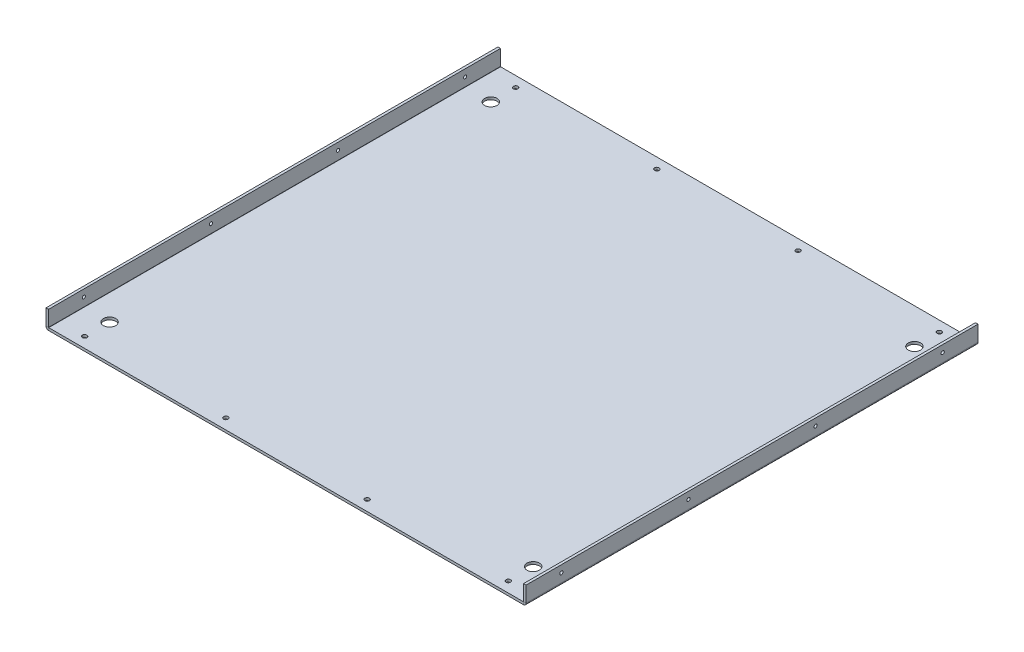
ISO-10303-21;
HEADER;
FILE_DESCRIPTION(('STEP AP214'),'2;1');
FILE_NAME('part.step','',(''),(''),'','','');
FILE_SCHEMA(('AUTOMOTIVE_DESIGN { 1 0 10303 214 1 1 1 1 }'));
ENDSEC;
DATA;
#1=APPLICATION_CONTEXT('core data for automotive mechanical design processes');
#2=APPLICATION_PROTOCOL_DEFINITION('international standard','automotive_design',2000,#1);
#3=PRODUCT_CONTEXT('',#1,'mechanical');
#4=PRODUCT('Part','Part','',(#3));
#5=PRODUCT_RELATED_PRODUCT_CATEGORY('part','',(#4));
#6=PRODUCT_DEFINITION_FORMATION('','',#4);
#7=PRODUCT_DEFINITION_CONTEXT('part definition',#1,'design');
#8=PRODUCT_DEFINITION('design','',#6,#7);
#9=PRODUCT_DEFINITION_SHAPE('','',#8);
#10=(LENGTH_UNIT() NAMED_UNIT(*) SI_UNIT(.MILLI.,.METRE.));
#11=(NAMED_UNIT(*) PLANE_ANGLE_UNIT() SI_UNIT($,.RADIAN.));
#12=(NAMED_UNIT(*) SI_UNIT($,.STERADIAN.) SOLID_ANGLE_UNIT());
#13=UNCERTAINTY_MEASURE_WITH_UNIT(LENGTH_MEASURE(1.E-05),#10,'distance_accuracy_value','');
#14=(GEOMETRIC_REPRESENTATION_CONTEXT(3) GLOBAL_UNCERTAINTY_ASSIGNED_CONTEXT((#13)) GLOBAL_UNIT_ASSIGNED_CONTEXT((#10,
#11,#12)) REPRESENTATION_CONTEXT('',''));
#15=CARTESIAN_POINT('',(0.,0.,0.));
#16=DIRECTION('',(0.,0.,1.));
#17=DIRECTION('',(1.,0.,0.));
#18=AXIS2_PLACEMENT_3D('',#15,#16,#17);
#19=CARTESIAN_POINT('',(0.,2.4384,406.4));
#20=DIRECTION('',(0.,0.,1.));
#21=DIRECTION('',(1.,0.,0.));
#22=AXIS2_PLACEMENT_3D('',#19,#20,#21);
#23=PLANE('',#22);
#24=DIRECTION('',(1.,0.,0.));
#25=VECTOR('',#24,1.);
#26=CARTESIAN_POINT('',(0.,2.4384,406.4));
#27=LINE('',#26,#25);
#28=CARTESIAN_POINT('',(0.,2.4384,406.4));
#29=VERTEX_POINT('',#28);
#30=CARTESIAN_POINT('',(2.286,2.4384,406.4));
#31=VERTEX_POINT('',#30);
#32=EDGE_CURVE('E11',#29,#31,#27,.T.);
#33=ORIENTED_EDGE('',*,*,#32,.F.);
#34=CARTESIAN_POINT('',(2.4384,2.4384,406.4));
#35=DIRECTION('',(0.,0.,-1.));
#36=DIRECTION('',(-1.,0.,0.));
#37=AXIS2_PLACEMENT_3D('',#34,#35,#36);
#38=CIRCLE('',#37,2.4384);
#39=CARTESIAN_POINT('',(2.4384,0.,406.4));
#40=VERTEX_POINT('',#39);
#41=EDGE_CURVE('E149',#29,#40,#38,.F.);
#42=ORIENTED_EDGE('',*,*,#41,.T.);
#43=DIRECTION('',(0.,-1.,0.));
#44=VECTOR('',#43,1.);
#45=CARTESIAN_POINT('',(2.4384,2.286,406.4));
#46=LINE('',#45,#44);
#47=CARTESIAN_POINT('',(2.4384,2.286,406.4));
#48=VERTEX_POINT('',#47);
#49=EDGE_CURVE('E47',#48,#40,#46,.T.);
#50=ORIENTED_EDGE('',*,*,#49,.F.);
#51=CARTESIAN_POINT('',(2.4384,2.4384,406.4));
#52=DIRECTION('',(0.,0.,1.));
#53=DIRECTION('',(1.,0.,0.));
#54=AXIS2_PLACEMENT_3D('',#51,#52,#53);
#55=CIRCLE('',#54,0.1524);
#56=EDGE_CURVE('E244',#31,#48,#55,.T.);
#57=ORIENTED_EDGE('',*,*,#56,.F.);
#58=EDGE_LOOP('',(#33,#42,#50,#57));
#59=FACE_BOUND('',#58,.T.);
#60=ADVANCED_FACE('F39',(#59),#23,.T.);
#61=CARTESIAN_POINT('',(2.4384,2.286,406.4));
#62=DIRECTION('',(0.,0.,1.));
#63=DIRECTION('',(1.,0.,0.));
#64=AXIS2_PLACEMENT_3D('',#61,#62,#63);
#65=PLANE('',#64);
#66=DIRECTION('',(0.,-1.,0.));
#67=VECTOR('',#66,1.);
#68=CARTESIAN_POINT('',(0.,0.,406.4));
#69=LINE('',#68,#67);
#70=CARTESIAN_POINT('',(0.,16.51,406.4));
#71=VERTEX_POINT('',#70);
#72=EDGE_CURVE('E154',#71,#29,#69,.T.);
#73=ORIENTED_EDGE('',*,*,#72,.T.);
#74=ORIENTED_EDGE('',*,*,#32,.T.);
#75=DIRECTION('',(0.,1.,0.));
#76=VECTOR('',#75,1.);
#77=CARTESIAN_POINT('',(2.286,0.,406.4));
#78=LINE('',#77,#76);
#79=CARTESIAN_POINT('',(2.286,16.51,406.4));
#80=VERTEX_POINT('',#79);
#81=EDGE_CURVE('E257',#80,#31,#78,.F.);
#82=ORIENTED_EDGE('',*,*,#81,.F.);
#83=DIRECTION('',(1.,0.,0.));
#84=VECTOR('',#83,1.);
#85=CARTESIAN_POINT('',(0.,16.51,406.4));
#86=LINE('',#85,#84);
#87=EDGE_CURVE('E259',#71,#80,#86,.T.);
#88=ORIENTED_EDGE('',*,*,#87,.F.);
#89=EDGE_LOOP('',(#73,#74,#82,#88));
#90=FACE_BOUND('',#89,.T.);
#91=ADVANCED_FACE('F270',(#90),#65,.T.);
#92=CARTESIAN_POINT('',(2.4384,0.,0.));
#93=DIRECTION('',(0.,0.,-1.));
#94=DIRECTION('',(-1.,0.,0.));
#95=AXIS2_PLACEMENT_3D('',#92,#93,#94);
#96=PLANE('',#95);
#97=DIRECTION('',(0.,1.,0.));
#98=VECTOR('',#97,1.);
#99=CARTESIAN_POINT('',(2.4384,0.,0.));
#100=LINE('',#99,#98);
#101=CARTESIAN_POINT('',(2.4384,0.,0.));
#102=VERTEX_POINT('',#101);
#103=CARTESIAN_POINT('',(2.4384,2.286,0.));
#104=VERTEX_POINT('',#103);
#105=EDGE_CURVE('E147',#102,#104,#100,.T.);
#106=ORIENTED_EDGE('',*,*,#105,.F.);
#107=CARTESIAN_POINT('',(2.4384,2.4384,0.));
#108=DIRECTION('',(0.,0.,-1.));
#109=DIRECTION('',(-1.,0.,0.));
#110=AXIS2_PLACEMENT_3D('',#107,#108,#109);
#111=CIRCLE('',#110,2.4384);
#112=CARTESIAN_POINT('',(0.,2.4384,0.));
#113=VERTEX_POINT('',#112);
#114=EDGE_CURVE('E161',#113,#102,#111,.F.);
#115=ORIENTED_EDGE('',*,*,#114,.F.);
#116=DIRECTION('',(-1.,0.,0.));
#117=VECTOR('',#116,1.);
#118=CARTESIAN_POINT('',(2.286,2.4384,0.));
#119=LINE('',#118,#117);
#120=CARTESIAN_POINT('',(2.286,2.4384,0.));
#121=VERTEX_POINT('',#120);
#122=EDGE_CURVE('E235',#121,#113,#119,.T.);
#123=ORIENTED_EDGE('',*,*,#122,.F.);
#124=CARTESIAN_POINT('',(2.4384,2.4384,0.));
#125=DIRECTION('',(0.,0.,1.));
#126=DIRECTION('',(1.,0.,0.));
#127=AXIS2_PLACEMENT_3D('',#124,#125,#126);
#128=CIRCLE('',#127,0.1524);
#129=EDGE_CURVE('E189',#121,#104,#128,.T.);
#130=ORIENTED_EDGE('',*,*,#129,.T.);
#131=EDGE_LOOP('',(#106,#115,#123,#130));
#132=FACE_BOUND('',#131,.T.);
#133=ADVANCED_FACE('F249',(#132),#96,.T.);
#134=CARTESIAN_POINT('',(2.286,2.4384,0.));
#135=DIRECTION('',(0.,0.,-1.));
#136=DIRECTION('',(-1.,0.,0.));
#137=AXIS2_PLACEMENT_3D('',#134,#135,#136);
#138=PLANE('',#137);
#139=DIRECTION('',(1.,0.,0.));
#140=VECTOR('',#139,1.);
#141=CARTESIAN_POINT('',(0.,0.,0.));
#142=LINE('',#141,#140);
#143=CARTESIAN_POINT('',(429.3616,0.,0.));
#144=VERTEX_POINT('',#143);
#145=EDGE_CURVE('E202',#102,#144,#142,.T.);
#146=ORIENTED_EDGE('',*,*,#145,.F.);
#147=ORIENTED_EDGE('',*,*,#105,.T.);
#148=DIRECTION('',(1.,0.,0.));
#149=VECTOR('',#148,1.);
#150=CARTESIAN_POINT('',(0.,2.286,0.));
#151=LINE('',#150,#149);
#152=CARTESIAN_POINT('',(429.3616,2.286,0.));
#153=VERTEX_POINT('',#152);
#154=EDGE_CURVE('E187',#104,#153,#151,.T.);
#155=ORIENTED_EDGE('',*,*,#154,.T.);
#156=DIRECTION('',(0.,-1.,0.));
#157=VECTOR('',#156,1.);
#158=CARTESIAN_POINT('',(429.3616,2.286,0.));
#159=LINE('',#158,#157);
#160=EDGE_CURVE('E96',#153,#144,#159,.T.);
#161=ORIENTED_EDGE('',*,*,#160,.T.);
#162=EDGE_LOOP('',(#146,#147,#155,#161));
#163=FACE_BOUND('',#162,.T.);
#164=ADVANCED_FACE('F237',(#163),#138,.T.);
#165=CARTESIAN_POINT('',(429.3616,0.,406.4));
#166=DIRECTION('',(0.,0.,1.));
#167=DIRECTION('',(1.,0.,0.));
#168=AXIS2_PLACEMENT_3D('',#165,#166,#167);
#169=PLANE('',#168);
#170=DIRECTION('',(0.,1.,0.));
#171=VECTOR('',#170,1.);
#172=CARTESIAN_POINT('',(429.3616,0.,406.4));
#173=LINE('',#172,#171);
#174=CARTESIAN_POINT('',(429.3616,0.,406.4));
#175=VERTEX_POINT('',#174);
#176=CARTESIAN_POINT('',(429.3616,2.286,406.4));
#177=VERTEX_POINT('',#176);
#178=EDGE_CURVE('E233',#175,#177,#173,.T.);
#179=ORIENTED_EDGE('',*,*,#178,.F.);
#180=CARTESIAN_POINT('',(429.3616,2.4384,406.4));
#181=DIRECTION('',(0.,0.,-1.));
#182=DIRECTION('',(-1.,0.,0.));
#183=AXIS2_PLACEMENT_3D('',#180,#181,#182);
#184=CIRCLE('',#183,2.4384);
#185=CARTESIAN_POINT('',(431.8,2.4384,406.4));
#186=VERTEX_POINT('',#185);
#187=EDGE_CURVE('E169',#175,#186,#184,.F.);
#188=ORIENTED_EDGE('',*,*,#187,.T.);
#189=DIRECTION('',(1.,0.,0.));
#190=VECTOR('',#189,1.);
#191=CARTESIAN_POINT('',(429.514,2.4384,406.4));
#192=LINE('',#191,#190);
#193=CARTESIAN_POINT('',(429.514,2.4384,406.4));
#194=VERTEX_POINT('',#193);
#195=EDGE_CURVE('E55',#194,#186,#192,.T.);
#196=ORIENTED_EDGE('',*,*,#195,.F.);
#197=CARTESIAN_POINT('',(429.3616,2.4384,406.4));
#198=DIRECTION('',(0.,0.,1.));
#199=DIRECTION('',(1.,0.,0.));
#200=AXIS2_PLACEMENT_3D('',#197,#198,#199);
#201=CIRCLE('',#200,0.1524);
#202=EDGE_CURVE('E261',#177,#194,#201,.T.);
#203=ORIENTED_EDGE('',*,*,#202,.F.);
#204=EDGE_LOOP('',(#179,#188,#196,#203));
#205=FACE_BOUND('',#204,.T.);
#206=ADVANCED_FACE('F298',(#205),#169,.T.);
#207=CARTESIAN_POINT('',(429.514,2.4384,406.4));
#208=DIRECTION('',(0.,0.,1.));
#209=DIRECTION('',(1.,0.,0.));
#210=AXIS2_PLACEMENT_3D('',#207,#208,#209);
#211=PLANE('',#210);
#212=DIRECTION('',(1.,0.,0.));
#213=VECTOR('',#212,1.);
#214=CARTESIAN_POINT('',(0.,0.,406.4));
#215=LINE('',#214,#213);
#216=EDGE_CURVE('E139',#40,#175,#215,.T.);
#217=ORIENTED_EDGE('',*,*,#216,.T.);
#218=ORIENTED_EDGE('',*,*,#178,.T.);
#219=DIRECTION('',(1.,0.,0.));
#220=VECTOR('',#219,1.);
#221=CARTESIAN_POINT('',(0.,2.286,406.4));
#222=LINE('',#221,#220);
#223=EDGE_CURVE('E142',#48,#177,#222,.T.);
#224=ORIENTED_EDGE('',*,*,#223,.F.);
#225=ORIENTED_EDGE('',*,*,#49,.T.);
#226=EDGE_LOOP('',(#217,#218,#224,#225));
#227=FACE_BOUND('',#226,.T.);
#228=ADVANCED_FACE('F137',(#227),#211,.T.);
#229=CARTESIAN_POINT('',(431.8,2.4384,0.));
#230=DIRECTION('',(0.,0.,-1.));
#231=DIRECTION('',(-1.,0.,0.));
#232=AXIS2_PLACEMENT_3D('',#229,#230,#231);
#233=PLANE('',#232);
#234=DIRECTION('',(-1.,0.,0.));
#235=VECTOR('',#234,1.);
#236=CARTESIAN_POINT('',(431.8,2.4384,0.));
#237=LINE('',#236,#235);
#238=CARTESIAN_POINT('',(431.8,2.4384,0.));
#239=VERTEX_POINT('',#238);
#240=CARTESIAN_POINT('',(429.514,2.4384,0.));
#241=VERTEX_POINT('',#240);
#242=EDGE_CURVE('E103',#239,#241,#237,.T.);
#243=ORIENTED_EDGE('',*,*,#242,.F.);
#244=CARTESIAN_POINT('',(429.3616,2.4384,0.));
#245=DIRECTION('',(0.,0.,-1.));
#246=DIRECTION('',(-1.,0.,0.));
#247=AXIS2_PLACEMENT_3D('',#244,#245,#246);
#248=CIRCLE('',#247,2.4384);
#249=EDGE_CURVE('E204',#144,#239,#248,.F.);
#250=ORIENTED_EDGE('',*,*,#249,.F.);
#251=ORIENTED_EDGE('',*,*,#160,.F.);
#252=CARTESIAN_POINT('',(429.3616,2.4384,0.));
#253=DIRECTION('',(0.,0.,1.));
#254=DIRECTION('',(1.,0.,0.));
#255=AXIS2_PLACEMENT_3D('',#252,#253,#254);
#256=CIRCLE('',#255,0.1524);
#257=EDGE_CURVE('E185',#153,#241,#256,.T.);
#258=ORIENTED_EDGE('',*,*,#257,.T.);
#259=EDGE_LOOP('',(#243,#250,#251,#258));
#260=FACE_BOUND('',#259,.T.);
#261=ADVANCED_FACE('F304',(#260),#233,.T.);
#262=CARTESIAN_POINT('',(429.3616,2.286,0.));
#263=DIRECTION('',(0.,0.,-1.));
#264=DIRECTION('',(-1.,0.,0.));
#265=AXIS2_PLACEMENT_3D('',#262,#263,#264);
#266=PLANE('',#265);
#267=DIRECTION('',(0.,1.,0.));
#268=VECTOR('',#267,1.);
#269=CARTESIAN_POINT('',(431.8,0.,0.));
#270=LINE('',#269,#268);
#271=CARTESIAN_POINT('',(431.8,16.51,0.));
#272=VERTEX_POINT('',#271);
#273=EDGE_CURVE('E175',#239,#272,#270,.T.);
#274=ORIENTED_EDGE('',*,*,#273,.F.);
#275=ORIENTED_EDGE('',*,*,#242,.T.);
#276=DIRECTION('',(0.,1.,0.));
#277=VECTOR('',#276,1.);
#278=CARTESIAN_POINT('',(429.514,0.,0.));
#279=LINE('',#278,#277);
#280=CARTESIAN_POINT('',(429.514,16.51,0.));
#281=VERTEX_POINT('',#280);
#282=EDGE_CURVE('E182',#241,#281,#279,.T.);
#283=ORIENTED_EDGE('',*,*,#282,.T.);
#284=DIRECTION('',(1.,0.,0.));
#285=VECTOR('',#284,1.);
#286=CARTESIAN_POINT('',(429.514,16.51,0.));
#287=LINE('',#286,#285);
#288=EDGE_CURVE('E178',#281,#272,#287,.T.);
#289=ORIENTED_EDGE('',*,*,#288,.T.);
#290=EDGE_LOOP('',(#274,#275,#283,#289));
#291=FACE_BOUND('',#290,.T.);
#292=ADVANCED_FACE('F307',(#291),#266,.T.);
#293=CARTESIAN_POINT('',(431.8,0.,406.4));
#294=DIRECTION('',(-1.,0.,0.));
#295=DIRECTION('',(0.,0.,1.));
#296=AXIS2_PLACEMENT_3D('',#293,#294,#295);
#297=PLANE('',#296);
#298=CARTESIAN_POINT('',(431.8,10.1599999999976,374.65));
#299=DIRECTION('',(1.,0.,0.));
#300=DIRECTION('',(0.,0.,-1.));
#301=AXIS2_PLACEMENT_3D('',#298,#299,#300);
#302=CIRCLE('',#301,1.4478);
#303=CARTESIAN_POINT('',(431.8,10.1599999999976,373.2022));
#304=VERTEX_POINT('',#303);
#305=EDGE_CURVE('E804',#304,#304,#302,.T.);
#306=ORIENTED_EDGE('',*,*,#305,.F.);
#307=EDGE_LOOP('',(#306));
#308=FACE_BOUND('',#307,.T.);
#309=CARTESIAN_POINT('',(431.8,10.1599999999984,260.35));
#310=DIRECTION('',(1.,0.,0.));
#311=DIRECTION('',(0.,0.,-1.));
#312=AXIS2_PLACEMENT_3D('',#309,#310,#311);
#313=CIRCLE('',#312,1.4478);
#314=CARTESIAN_POINT('',(431.8,10.1599999999984,258.9022));
#315=VERTEX_POINT('',#314);
#316=EDGE_CURVE('E792',#315,#315,#313,.T.);
#317=ORIENTED_EDGE('',*,*,#316,.F.);
#318=EDGE_LOOP('',(#317));
#319=FACE_BOUND('',#318,.T.);
#320=CARTESIAN_POINT('',(431.8,10.1599999999992,146.05));
#321=DIRECTION('',(1.,0.,0.));
#322=DIRECTION('',(0.,0.,-1.));
#323=AXIS2_PLACEMENT_3D('',#320,#321,#322);
#324=CIRCLE('',#323,1.4478);
#325=CARTESIAN_POINT('',(431.8,10.1599999999992,144.6022));
#326=VERTEX_POINT('',#325);
#327=EDGE_CURVE('E780',#326,#326,#324,.T.);
#328=ORIENTED_EDGE('',*,*,#327,.F.);
#329=EDGE_LOOP('',(#328));
#330=FACE_BOUND('',#329,.T.);
#331=CARTESIAN_POINT('',(431.8,10.16,31.75));
#332=DIRECTION('',(1.,0.,0.));
#333=DIRECTION('',(0.,0.,-1.));
#334=AXIS2_PLACEMENT_3D('',#331,#332,#333);
#335=CIRCLE('',#334,1.4478);
#336=CARTESIAN_POINT('',(431.8,10.16,30.3022));
#337=VERTEX_POINT('',#336);
#338=EDGE_CURVE('E768',#337,#337,#335,.T.);
#339=ORIENTED_EDGE('',*,*,#338,.F.);
#340=EDGE_LOOP('',(#339));
#341=FACE_BOUND('',#340,.T.);
#342=ORIENTED_EDGE('',*,*,#273,.T.);
#343=DIRECTION('',(0.,0.,-1.));
#344=VECTOR('',#343,1.);
#345=CARTESIAN_POINT('',(431.8,16.51,406.4));
#346=LINE('',#345,#344);
#347=CARTESIAN_POINT('',(431.8,16.51,406.4));
#348=VERTEX_POINT('',#347);
#349=EDGE_CURVE('E228',#348,#272,#346,.T.);
#350=ORIENTED_EDGE('',*,*,#349,.F.);
#351=DIRECTION('',(0.,1.,0.));
#352=VECTOR('',#351,1.);
#353=CARTESIAN_POINT('',(431.8,0.,406.4));
#354=LINE('',#353,#352);
#355=EDGE_CURVE('E109',#186,#348,#354,.T.);
#356=ORIENTED_EDGE('',*,*,#355,.F.);
#357=DIRECTION('',(0.,0.,-1.));
#358=VECTOR('',#357,1.);
#359=CARTESIAN_POINT('',(431.8,2.4384,406.4));
#360=LINE('',#359,#358);
#361=EDGE_CURVE('E171',#186,#239,#360,.T.);
#362=ORIENTED_EDGE('',*,*,#361,.T.);
#363=EDGE_LOOP('',(#342,#350,#356,#362));
#364=FACE_BOUND('',#363,.T.);
#365=ADVANCED_FACE('F310',(#308,#319,#330,#341,#364),#297,.F.);
#366=CARTESIAN_POINT('',(429.514,16.51,406.4));
#367=DIRECTION('',(0.,1.,0.));
#368=DIRECTION('',(0.,0.,1.));
#369=AXIS2_PLACEMENT_3D('',#366,#367,#368);
#370=PLANE('',#369);
#371=ORIENTED_EDGE('',*,*,#288,.F.);
#372=DIRECTION('',(0.,0.,-1.));
#373=VECTOR('',#372,1.);
#374=CARTESIAN_POINT('',(429.514,16.51,406.4));
#375=LINE('',#374,#373);
#376=CARTESIAN_POINT('',(429.514,16.51,406.4));
#377=VERTEX_POINT('',#376);
#378=EDGE_CURVE('E226',#377,#281,#375,.T.);
#379=ORIENTED_EDGE('',*,*,#378,.F.);
#380=DIRECTION('',(1.,0.,0.));
#381=VECTOR('',#380,1.);
#382=CARTESIAN_POINT('',(429.514,16.51,406.4));
#383=LINE('',#382,#381);
#384=EDGE_CURVE('E751',#377,#348,#383,.T.);
#385=ORIENTED_EDGE('',*,*,#384,.T.);
#386=ORIENTED_EDGE('',*,*,#349,.T.);
#387=EDGE_LOOP('',(#371,#379,#385,#386));
#388=FACE_BOUND('',#387,.T.);
#389=ADVANCED_FACE('F314',(#388),#370,.T.);
#390=CARTESIAN_POINT('',(429.514,0.,406.4));
#391=DIRECTION('',(-1.,0.,0.));
#392=DIRECTION('',(0.,0.,1.));
#393=AXIS2_PLACEMENT_3D('',#390,#391,#392);
#394=PLANE('',#393);
#395=CARTESIAN_POINT('',(429.514,10.1599999999976,374.65));
#396=DIRECTION('',(-1.,0.,0.));
#397=DIRECTION('',(0.,0.,1.));
#398=AXIS2_PLACEMENT_3D('',#395,#396,#397);
#399=CIRCLE('',#398,1.4478);
#400=CARTESIAN_POINT('',(429.514,10.1599999999976,376.0978));
#401=VERTEX_POINT('',#400);
#402=EDGE_CURVE('E795',#401,#401,#399,.T.);
#403=ORIENTED_EDGE('',*,*,#402,.F.);
#404=EDGE_LOOP('',(#403));
#405=FACE_BOUND('',#404,.T.);
#406=CARTESIAN_POINT('',(429.514,10.1599999999984,260.35));
#407=DIRECTION('',(-1.,0.,0.));
#408=DIRECTION('',(0.,0.,1.));
#409=AXIS2_PLACEMENT_3D('',#406,#407,#408);
#410=CIRCLE('',#409,1.4478);
#411=CARTESIAN_POINT('',(429.514,10.1599999999984,261.7978));
#412=VERTEX_POINT('',#411);
#413=EDGE_CURVE('E783',#412,#412,#410,.T.);
#414=ORIENTED_EDGE('',*,*,#413,.F.);
#415=EDGE_LOOP('',(#414));
#416=FACE_BOUND('',#415,.T.);
#417=CARTESIAN_POINT('',(429.514,10.1599999999992,146.05));
#418=DIRECTION('',(-1.,0.,0.));
#419=DIRECTION('',(0.,0.,1.));
#420=AXIS2_PLACEMENT_3D('',#417,#418,#419);
#421=CIRCLE('',#420,1.4478);
#422=CARTESIAN_POINT('',(429.514,10.1599999999992,147.4978));
#423=VERTEX_POINT('',#422);
#424=EDGE_CURVE('E771',#423,#423,#421,.T.);
#425=ORIENTED_EDGE('',*,*,#424,.F.);
#426=EDGE_LOOP('',(#425));
#427=FACE_BOUND('',#426,.T.);
#428=CARTESIAN_POINT('',(429.514,10.16,31.75));
#429=DIRECTION('',(-1.,0.,0.));
#430=DIRECTION('',(0.,0.,1.));
#431=AXIS2_PLACEMENT_3D('',#428,#429,#430);
#432=CIRCLE('',#431,1.4478);
#433=CARTESIAN_POINT('',(429.514,10.16,33.1978));
#434=VERTEX_POINT('',#433);
#435=EDGE_CURVE('E179',#434,#434,#432,.T.);
#436=ORIENTED_EDGE('',*,*,#435,.F.);
#437=EDGE_LOOP('',(#436));
#438=FACE_BOUND('',#437,.T.);
#439=ORIENTED_EDGE('',*,*,#282,.F.);
#440=DIRECTION('',(0.,0.,-1.));
#441=VECTOR('',#440,1.);
#442=CARTESIAN_POINT('',(429.514,2.4384,406.4));
#443=LINE('',#442,#441);
#444=EDGE_CURVE('E223',#194,#241,#443,.T.);
#445=ORIENTED_EDGE('',*,*,#444,.F.);
#446=DIRECTION('',(0.,1.,0.));
#447=VECTOR('',#446,1.);
#448=CARTESIAN_POINT('',(429.514,0.,406.4));
#449=LINE('',#448,#447);
#450=EDGE_CURVE('E753',#194,#377,#449,.T.);
#451=ORIENTED_EDGE('',*,*,#450,.T.);
#452=ORIENTED_EDGE('',*,*,#378,.T.);
#453=EDGE_LOOP('',(#439,#445,#451,#452));
#454=FACE_BOUND('',#453,.T.);
#455=ADVANCED_FACE('F318',(#405,#416,#427,#438,#454),#394,.T.);
#456=CARTESIAN_POINT('',(429.3616,2.4384,406.4));
#457=DIRECTION('',(0.,0.,-1.));
#458=DIRECTION('',(-1.,0.,0.));
#459=AXIS2_PLACEMENT_3D('',#456,#457,#458);
#460=CYLINDRICAL_SURFACE('',#459,0.1524);
#461=ORIENTED_EDGE('',*,*,#257,.F.);
#462=DIRECTION('',(0.,0.,-1.));
#463=VECTOR('',#462,1.);
#464=CARTESIAN_POINT('',(429.3616,2.286,406.4));
#465=LINE('',#464,#463);
#466=EDGE_CURVE('E220',#177,#153,#465,.T.);
#467=ORIENTED_EDGE('',*,*,#466,.F.);
#468=ORIENTED_EDGE('',*,*,#202,.T.);
#469=ORIENTED_EDGE('',*,*,#444,.T.);
#470=EDGE_LOOP('',(#461,#467,#468,#469));
#471=FACE_BOUND('',#470,.T.);
#472=ADVANCED_FACE('F322',(#471),#460,.F.);
#473=CARTESIAN_POINT('',(0.,2.286,406.4));
#474=DIRECTION('',(0.,1.,0.));
#475=DIRECTION('',(0.,0.,1.));
#476=AXIS2_PLACEMENT_3D('',#473,#474,#475);
#477=PLANE('',#476);
#478=CARTESIAN_POINT('',(25.4,2.286,31.75));
#479=DIRECTION('',(0.,1.,0.));
#480=DIRECTION('',(0.,0.,1.));
#481=AXIS2_PLACEMENT_3D('',#478,#479,#480);
#482=CIRCLE('',#481,5.55625);
#483=CARTESIAN_POINT('',(25.4,2.286,37.30625));
#484=VERTEX_POINT('',#483);
#485=EDGE_CURVE('E878',#484,#484,#482,.T.);
#486=ORIENTED_EDGE('',*,*,#485,.F.);
#487=EDGE_LOOP('',(#486));
#488=FACE_BOUND('',#487,.T.);
#489=CARTESIAN_POINT('',(406.4,2.286,31.75));
#490=DIRECTION('',(0.,1.,0.));
#491=DIRECTION('',(0.,0.,1.));
#492=AXIS2_PLACEMENT_3D('',#489,#490,#491);
#493=CIRCLE('',#492,5.55624999999998);
#494=CARTESIAN_POINT('',(406.4,2.286,37.30625));
#495=VERTEX_POINT('',#494);
#496=EDGE_CURVE('E872',#495,#495,#493,.T.);
#497=ORIENTED_EDGE('',*,*,#496,.F.);
#498=EDGE_LOOP('',(#497));
#499=FACE_BOUND('',#498,.T.);
#500=CARTESIAN_POINT('',(406.4,2.286,374.65));
#501=DIRECTION('',(0.,1.,0.));
#502=DIRECTION('',(0.,0.,1.));
#503=AXIS2_PLACEMENT_3D('',#500,#501,#502);
#504=CIRCLE('',#503,5.55624999999998);
#505=CARTESIAN_POINT('',(406.4,2.286,380.20625));
#506=VERTEX_POINT('',#505);
#507=EDGE_CURVE('E866',#506,#506,#504,.T.);
#508=ORIENTED_EDGE('',*,*,#507,.F.);
#509=EDGE_LOOP('',(#508));
#510=FACE_BOUND('',#509,.T.);
#511=CARTESIAN_POINT('',(25.4,2.286,374.65));
#512=DIRECTION('',(0.,1.,0.));
#513=DIRECTION('',(0.,0.,1.));
#514=AXIS2_PLACEMENT_3D('',#511,#512,#513);
#515=CIRCLE('',#514,5.55625);
#516=CARTESIAN_POINT('',(25.4,2.286,380.20625));
#517=VERTEX_POINT('',#516);
#518=EDGE_CURVE('E860',#517,#517,#515,.T.);
#519=ORIENTED_EDGE('',*,*,#518,.F.);
#520=EDGE_LOOP('',(#519));
#521=FACE_BOUND('',#520,.T.);
#522=CARTESIAN_POINT('',(25.3999999999959,2.286,9.39799999999996));
#523=DIRECTION('',(0.,1.,0.));
#524=DIRECTION('',(0.,0.,1.));
#525=AXIS2_PLACEMENT_3D('',#522,#523,#524);
#526=CIRCLE('',#525,2.03199999999993);
#527=CARTESIAN_POINT('',(25.3999999999959,2.286,11.4299999999999));
#528=VERTEX_POINT('',#527);
#529=EDGE_CURVE('E852',#528,#528,#526,.T.);
#530=ORIENTED_EDGE('',*,*,#529,.F.);
#531=EDGE_LOOP('',(#530));
#532=FACE_BOUND('',#531,.T.);
#533=CARTESIAN_POINT('',(152.399999999996,2.286,9.39799999999996));
#534=DIRECTION('',(0.,1.,0.));
#535=DIRECTION('',(0.,0.,1.));
#536=AXIS2_PLACEMENT_3D('',#533,#534,#535);
#537=CIRCLE('',#536,2.03199999999995);
#538=CARTESIAN_POINT('',(152.399999999996,2.286,11.4299999999999));
#539=VERTEX_POINT('',#538);
#540=EDGE_CURVE('E846',#539,#539,#537,.T.);
#541=ORIENTED_EDGE('',*,*,#540,.F.);
#542=EDGE_LOOP('',(#541));
#543=FACE_BOUND('',#542,.T.);
#544=CARTESIAN_POINT('',(279.399999999996,2.286,9.39799999999996));
#545=DIRECTION('',(0.,1.,0.));
#546=DIRECTION('',(0.,0.,1.));
#547=AXIS2_PLACEMENT_3D('',#544,#545,#546);
#548=CIRCLE('',#547,2.03199999999995);
#549=CARTESIAN_POINT('',(279.399999999996,2.286,11.4299999999999));
#550=VERTEX_POINT('',#549);
#551=EDGE_CURVE('E840',#550,#550,#548,.T.);
#552=ORIENTED_EDGE('',*,*,#551,.F.);
#553=EDGE_LOOP('',(#552));
#554=FACE_BOUND('',#553,.T.);
#555=CARTESIAN_POINT('',(406.399999999996,2.286,9.39799999999996));
#556=DIRECTION('',(0.,1.,0.));
#557=DIRECTION('',(0.,0.,1.));
#558=AXIS2_PLACEMENT_3D('',#555,#556,#557);
#559=CIRCLE('',#558,2.03199999999995);
#560=CARTESIAN_POINT('',(406.399999999996,2.286,11.4299999999999));
#561=VERTEX_POINT('',#560);
#562=EDGE_CURVE('E834',#561,#561,#559,.T.);
#563=ORIENTED_EDGE('',*,*,#562,.F.);
#564=EDGE_LOOP('',(#563));
#565=FACE_BOUND('',#564,.T.);
#566=CARTESIAN_POINT('',(25.4,2.286,397.002));
#567=DIRECTION('',(0.,1.,0.));
#568=DIRECTION('',(0.,0.,1.));
#569=AXIS2_PLACEMENT_3D('',#566,#567,#568);
#570=CIRCLE('',#569,2.03199999999992);
#571=CARTESIAN_POINT('',(25.4,2.286,399.034));
#572=VERTEX_POINT('',#571);
#573=EDGE_CURVE('E828',#572,#572,#570,.T.);
#574=ORIENTED_EDGE('',*,*,#573,.F.);
#575=EDGE_LOOP('',(#574));
#576=FACE_BOUND('',#575,.T.);
#577=CARTESIAN_POINT('',(152.4,2.286,397.002));
#578=DIRECTION('',(0.,1.,0.));
#579=DIRECTION('',(0.,0.,1.));
#580=AXIS2_PLACEMENT_3D('',#577,#578,#579);
#581=CIRCLE('',#580,2.03199999999994);
#582=CARTESIAN_POINT('',(152.4,2.286,399.034));
#583=VERTEX_POINT('',#582);
#584=EDGE_CURVE('E822',#583,#583,#581,.T.);
#585=ORIENTED_EDGE('',*,*,#584,.F.);
#586=EDGE_LOOP('',(#585));
#587=FACE_BOUND('',#586,.T.);
#588=CARTESIAN_POINT('',(279.4,2.286,397.002));
#589=DIRECTION('',(0.,1.,0.));
#590=DIRECTION('',(0.,0.,1.));
#591=AXIS2_PLACEMENT_3D('',#588,#589,#590);
#592=CIRCLE('',#591,2.03199999999994);
#593=CARTESIAN_POINT('',(279.4,2.286,399.034));
#594=VERTEX_POINT('',#593);
#595=EDGE_CURVE('E816',#594,#594,#592,.T.);
#596=ORIENTED_EDGE('',*,*,#595,.F.);
#597=EDGE_LOOP('',(#596));
#598=FACE_BOUND('',#597,.T.);
#599=CARTESIAN_POINT('',(406.4,2.286,397.002));
#600=DIRECTION('',(0.,1.,0.));
#601=DIRECTION('',(0.,0.,1.));
#602=AXIS2_PLACEMENT_3D('',#599,#600,#601);
#603=CIRCLE('',#602,2.03199999999994);
#604=CARTESIAN_POINT('',(406.4,2.286,399.034));
#605=VERTEX_POINT('',#604);
#606=EDGE_CURVE('E810',#605,#605,#603,.T.);
#607=ORIENTED_EDGE('',*,*,#606,.F.);
#608=EDGE_LOOP('',(#607));
#609=FACE_BOUND('',#608,.T.);
#610=ORIENTED_EDGE('',*,*,#154,.F.);
#611=DIRECTION('',(0.,0.,-1.));
#612=VECTOR('',#611,1.);
#613=CARTESIAN_POINT('',(2.4384,2.286,406.4));
#614=LINE('',#613,#612);
#615=EDGE_CURVE('E217',#48,#104,#614,.T.);
#616=ORIENTED_EDGE('',*,*,#615,.F.);
#617=ORIENTED_EDGE('',*,*,#223,.T.);
#618=ORIENTED_EDGE('',*,*,#466,.T.);
#619=EDGE_LOOP('',(#610,#616,#617,#618));
#620=FACE_BOUND('',#619,.T.);
#621=ADVANCED_FACE('F246',(#488,#499,#510,#521,#532,#543,#554,#565,#576,#587,#598,#609,#620),
#477,.T.);
#622=CARTESIAN_POINT('',(2.4384,2.4384,406.4));
#623=DIRECTION('',(0.,0.,-1.));
#624=DIRECTION('',(-1.,0.,0.));
#625=AXIS2_PLACEMENT_3D('',#622,#623,#624);
#626=CYLINDRICAL_SURFACE('',#625,0.1524);
#627=ORIENTED_EDGE('',*,*,#129,.F.);
#628=DIRECTION('',(0.,0.,-1.));
#629=VECTOR('',#628,1.);
#630=CARTESIAN_POINT('',(2.286,2.4384,406.4));
#631=LINE('',#630,#629);
#632=EDGE_CURVE('E214',#31,#121,#631,.T.);
#633=ORIENTED_EDGE('',*,*,#632,.F.);
#634=ORIENTED_EDGE('',*,*,#56,.T.);
#635=ORIENTED_EDGE('',*,*,#615,.T.);
#636=EDGE_LOOP('',(#627,#633,#634,#635));
#637=FACE_BOUND('',#636,.T.);
#638=ADVANCED_FACE('F242',(#637),#626,.F.);
#639=CARTESIAN_POINT('',(2.286,0.,406.4));
#640=DIRECTION('',(1.,0.,0.));
#641=DIRECTION('',(0.,0.,-1.));
#642=AXIS2_PLACEMENT_3D('',#639,#640,#641);
#643=PLANE('',#642);
#644=CARTESIAN_POINT('',(2.286,10.1599999999976,374.65));
#645=DIRECTION('',(1.,0.,0.));
#646=DIRECTION('',(0.,0.,-1.));
#647=AXIS2_PLACEMENT_3D('',#644,#645,#646);
#648=CIRCLE('',#647,1.4478);
#649=CARTESIAN_POINT('',(2.286,10.1599999999976,373.2022));
#650=VERTEX_POINT('',#649);
#651=EDGE_CURVE('E800',#650,#650,#648,.T.);
#652=ORIENTED_EDGE('',*,*,#651,.F.);
#653=EDGE_LOOP('',(#652));
#654=FACE_BOUND('',#653,.T.);
#655=CARTESIAN_POINT('',(2.286,10.1599999999984,260.35));
#656=DIRECTION('',(1.,0.,0.));
#657=DIRECTION('',(0.,0.,-1.));
#658=AXIS2_PLACEMENT_3D('',#655,#656,#657);
#659=CIRCLE('',#658,1.4478);
#660=CARTESIAN_POINT('',(2.286,10.1599999999984,258.9022));
#661=VERTEX_POINT('',#660);
#662=EDGE_CURVE('E788',#661,#661,#659,.T.);
#663=ORIENTED_EDGE('',*,*,#662,.F.);
#664=EDGE_LOOP('',(#663));
#665=FACE_BOUND('',#664,.T.);
#666=CARTESIAN_POINT('',(2.286,10.1599999999992,146.05));
#667=DIRECTION('',(1.,0.,0.));
#668=DIRECTION('',(0.,0.,-1.));
#669=AXIS2_PLACEMENT_3D('',#666,#667,#668);
#670=CIRCLE('',#669,1.4478);
#671=CARTESIAN_POINT('',(2.286,10.1599999999992,144.6022));
#672=VERTEX_POINT('',#671);
#673=EDGE_CURVE('E776',#672,#672,#670,.T.);
#674=ORIENTED_EDGE('',*,*,#673,.F.);
#675=EDGE_LOOP('',(#674));
#676=FACE_BOUND('',#675,.T.);
#677=CARTESIAN_POINT('',(2.286,10.16,31.75));
#678=DIRECTION('',(1.,0.,0.));
#679=DIRECTION('',(0.,0.,-1.));
#680=AXIS2_PLACEMENT_3D('',#677,#678,#679);
#681=CIRCLE('',#680,1.4478);
#682=CARTESIAN_POINT('',(2.286,10.16,30.3022));
#683=VERTEX_POINT('',#682);
#684=EDGE_CURVE('E764',#683,#683,#681,.T.);
#685=ORIENTED_EDGE('',*,*,#684,.F.);
#686=EDGE_LOOP('',(#685));
#687=FACE_BOUND('',#686,.T.);
#688=DIRECTION('',(0.,1.,0.));
#689=VECTOR('',#688,1.);
#690=CARTESIAN_POINT('',(2.286,0.,0.));
#691=LINE('',#690,#689);
#692=CARTESIAN_POINT('',(2.286,16.51,0.));
#693=VERTEX_POINT('',#692);
#694=EDGE_CURVE('E192',#693,#121,#691,.F.);
#695=ORIENTED_EDGE('',*,*,#694,.F.);
#696=DIRECTION('',(0.,0.,-1.));
#697=VECTOR('',#696,1.);
#698=CARTESIAN_POINT('',(2.286,16.51,406.4));
#699=LINE('',#698,#697);
#700=EDGE_CURVE('E212',#80,#693,#699,.T.);
#701=ORIENTED_EDGE('',*,*,#700,.F.);
#702=ORIENTED_EDGE('',*,*,#81,.T.);
#703=ORIENTED_EDGE('',*,*,#632,.T.);
#704=EDGE_LOOP('',(#695,#701,#702,#703));
#705=FACE_BOUND('',#704,.T.);
#706=ADVANCED_FACE('F255',(#654,#665,#676,#687,#705),#643,.T.);
#707=CARTESIAN_POINT('',(0.,16.51,406.4));
#708=DIRECTION('',(0.,1.,0.));
#709=DIRECTION('',(0.,0.,1.));
#710=AXIS2_PLACEMENT_3D('',#707,#708,#709);
#711=PLANE('',#710);
#712=DIRECTION('',(1.,0.,0.));
#713=VECTOR('',#712,1.);
#714=CARTESIAN_POINT('',(0.,16.51,0.));
#715=LINE('',#714,#713);
#716=CARTESIAN_POINT('',(0.,16.51,0.));
#717=VERTEX_POINT('',#716);
#718=EDGE_CURVE('E195',#717,#693,#715,.T.);
#719=ORIENTED_EDGE('',*,*,#718,.F.);
#720=DIRECTION('',(0.,0.,-1.));
#721=VECTOR('',#720,1.);
#722=CARTESIAN_POINT('',(0.,16.51,406.4));
#723=LINE('',#722,#721);
#724=EDGE_CURVE('E210',#71,#717,#723,.T.);
#725=ORIENTED_EDGE('',*,*,#724,.F.);
#726=ORIENTED_EDGE('',*,*,#87,.T.);
#727=ORIENTED_EDGE('',*,*,#700,.T.);
#728=EDGE_LOOP('',(#719,#725,#726,#727));
#729=FACE_BOUND('',#728,.T.);
#730=ADVANCED_FACE('F276',(#729),#711,.T.);
#731=CARTESIAN_POINT('',(0.,0.,406.4));
#732=DIRECTION('',(1.,0.,0.));
#733=DIRECTION('',(0.,0.,-1.));
#734=AXIS2_PLACEMENT_3D('',#731,#732,#733);
#735=PLANE('',#734);
#736=CARTESIAN_POINT('',(0.,10.1599999999976,374.65));
#737=DIRECTION('',(1.,0.,0.));
#738=DIRECTION('',(0.,0.,-1.));
#739=AXIS2_PLACEMENT_3D('',#736,#737,#738);
#740=CIRCLE('',#739,1.4478);
#741=CARTESIAN_POINT('',(0.,10.1599999999976,373.2022));
#742=VERTEX_POINT('',#741);
#743=EDGE_CURVE('E803',#742,#742,#740,.T.);
#744=ORIENTED_EDGE('',*,*,#743,.T.);
#745=EDGE_LOOP('',(#744));
#746=FACE_BOUND('',#745,.T.);
#747=CARTESIAN_POINT('',(0.,10.1599999999984,260.35));
#748=DIRECTION('',(1.,0.,0.));
#749=DIRECTION('',(0.,0.,-1.));
#750=AXIS2_PLACEMENT_3D('',#747,#748,#749);
#751=CIRCLE('',#750,1.4478);
#752=CARTESIAN_POINT('',(0.,10.1599999999984,258.9022));
#753=VERTEX_POINT('',#752);
#754=EDGE_CURVE('E791',#753,#753,#751,.T.);
#755=ORIENTED_EDGE('',*,*,#754,.T.);
#756=EDGE_LOOP('',(#755));
#757=FACE_BOUND('',#756,.T.);
#758=CARTESIAN_POINT('',(0.,10.1599999999992,146.05));
#759=DIRECTION('',(1.,0.,0.));
#760=DIRECTION('',(0.,0.,-1.));
#761=AXIS2_PLACEMENT_3D('',#758,#759,#760);
#762=CIRCLE('',#761,1.4478);
#763=CARTESIAN_POINT('',(0.,10.1599999999992,144.6022));
#764=VERTEX_POINT('',#763);
#765=EDGE_CURVE('E779',#764,#764,#762,.T.);
#766=ORIENTED_EDGE('',*,*,#765,.T.);
#767=EDGE_LOOP('',(#766));
#768=FACE_BOUND('',#767,.T.);
#769=CARTESIAN_POINT('',(0.,10.16,31.75));
#770=DIRECTION('',(1.,0.,0.));
#771=DIRECTION('',(0.,0.,-1.));
#772=AXIS2_PLACEMENT_3D('',#769,#770,#771);
#773=CIRCLE('',#772,1.4478);
#774=CARTESIAN_POINT('',(0.,10.16,30.3022));
#775=VERTEX_POINT('',#774);
#776=EDGE_CURVE('E767',#775,#775,#773,.T.);
#777=ORIENTED_EDGE('',*,*,#776,.T.);
#778=EDGE_LOOP('',(#777));
#779=FACE_BOUND('',#778,.T.);
#780=DIRECTION('',(0.,-1.,0.));
#781=VECTOR('',#780,1.);
#782=CARTESIAN_POINT('',(0.,0.,0.));
#783=LINE('',#782,#781);
#784=EDGE_CURVE('E198',#717,#113,#783,.T.);
#785=ORIENTED_EDGE('',*,*,#784,.T.);
#786=DIRECTION('',(0.,0.,-1.));
#787=VECTOR('',#786,1.);
#788=CARTESIAN_POINT('',(0.,2.4384,406.4));
#789=LINE('',#788,#787);
#790=EDGE_CURVE('E163',#29,#113,#789,.T.);
#791=ORIENTED_EDGE('',*,*,#790,.F.);
#792=ORIENTED_EDGE('',*,*,#72,.F.);
#793=ORIENTED_EDGE('',*,*,#724,.T.);
#794=EDGE_LOOP('',(#785,#791,#792,#793));
#795=FACE_BOUND('',#794,.T.);
#796=ADVANCED_FACE('F272',(#746,#757,#768,#779,#795),#735,.F.);
#797=CARTESIAN_POINT('',(2.4384,2.4384,406.4));
#798=DIRECTION('',(0.,0.,-1.));
#799=DIRECTION('',(-1.,0.,0.));
#800=AXIS2_PLACEMENT_3D('',#797,#798,#799);
#801=CYLINDRICAL_SURFACE('',#800,2.4384);
#802=ORIENTED_EDGE('',*,*,#114,.T.);
#803=DIRECTION('',(0.,0.,-1.));
#804=VECTOR('',#803,1.);
#805=CARTESIAN_POINT('',(2.4384,0.,406.4));
#806=LINE('',#805,#804);
#807=EDGE_CURVE('E158',#40,#102,#806,.T.);
#808=ORIENTED_EDGE('',*,*,#807,.F.);
#809=ORIENTED_EDGE('',*,*,#41,.F.);
#810=ORIENTED_EDGE('',*,*,#790,.T.);
#811=EDGE_LOOP('',(#802,#808,#809,#810));
#812=FACE_BOUND('',#811,.T.);
#813=ADVANCED_FACE('F159',(#812),#801,.T.);
#814=CARTESIAN_POINT('',(0.,0.,406.4));
#815=DIRECTION('',(0.,1.,0.));
#816=DIRECTION('',(0.,0.,1.));
#817=AXIS2_PLACEMENT_3D('',#814,#815,#816);
#818=PLANE('',#817);
#819=CARTESIAN_POINT('',(25.4,0.,31.75));
#820=DIRECTION('',(0.,1.,0.));
#821=DIRECTION('',(0.,0.,1.));
#822=AXIS2_PLACEMENT_3D('',#819,#820,#821);
#823=CIRCLE('',#822,5.55625);
#824=CARTESIAN_POINT('',(25.4,0.,37.30625));
#825=VERTEX_POINT('',#824);
#826=EDGE_CURVE('E875',#825,#825,#823,.T.);
#827=ORIENTED_EDGE('',*,*,#826,.T.);
#828=EDGE_LOOP('',(#827));
#829=FACE_BOUND('',#828,.T.);
#830=CARTESIAN_POINT('',(406.4,0.,31.75));
#831=DIRECTION('',(0.,1.,0.));
#832=DIRECTION('',(0.,0.,1.));
#833=AXIS2_PLACEMENT_3D('',#830,#831,#832);
#834=CIRCLE('',#833,5.55624999999998);
#835=CARTESIAN_POINT('',(406.4,0.,37.30625));
#836=VERTEX_POINT('',#835);
#837=EDGE_CURVE('E869',#836,#836,#834,.T.);
#838=ORIENTED_EDGE('',*,*,#837,.T.);
#839=EDGE_LOOP('',(#838));
#840=FACE_BOUND('',#839,.T.);
#841=CARTESIAN_POINT('',(406.4,0.,374.65));
#842=DIRECTION('',(0.,1.,0.));
#843=DIRECTION('',(0.,0.,1.));
#844=AXIS2_PLACEMENT_3D('',#841,#842,#843);
#845=CIRCLE('',#844,5.55624999999998);
#846=CARTESIAN_POINT('',(406.4,0.,380.20625));
#847=VERTEX_POINT('',#846);
#848=EDGE_CURVE('E863',#847,#847,#845,.T.);
#849=ORIENTED_EDGE('',*,*,#848,.T.);
#850=EDGE_LOOP('',(#849));
#851=FACE_BOUND('',#850,.T.);
#852=CARTESIAN_POINT('',(25.4,0.,374.65));
#853=DIRECTION('',(0.,1.,0.));
#854=DIRECTION('',(0.,0.,1.));
#855=AXIS2_PLACEMENT_3D('',#852,#853,#854);
#856=CIRCLE('',#855,5.55625);
#857=CARTESIAN_POINT('',(25.4,0.,380.20625));
#858=VERTEX_POINT('',#857);
#859=EDGE_CURVE('E855',#858,#858,#856,.T.);
#860=ORIENTED_EDGE('',*,*,#859,.T.);
#861=EDGE_LOOP('',(#860));
#862=FACE_BOUND('',#861,.T.);
#863=CARTESIAN_POINT('',(25.3999999999959,0.,9.39799999999996));
#864=DIRECTION('',(0.,1.,0.));
#865=DIRECTION('',(0.,0.,1.));
#866=AXIS2_PLACEMENT_3D('',#863,#864,#865);
#867=CIRCLE('',#866,2.03199999999993);
#868=CARTESIAN_POINT('',(25.3999999999959,0.,11.4299999999999));
#869=VERTEX_POINT('',#868);
#870=EDGE_CURVE('E849',#869,#869,#867,.T.);
#871=ORIENTED_EDGE('',*,*,#870,.T.);
#872=EDGE_LOOP('',(#871));
#873=FACE_BOUND('',#872,.T.);
#874=CARTESIAN_POINT('',(152.399999999996,0.,9.39799999999996));
#875=DIRECTION('',(0.,1.,0.));
#876=DIRECTION('',(0.,0.,1.));
#877=AXIS2_PLACEMENT_3D('',#874,#875,#876);
#878=CIRCLE('',#877,2.03199999999995);
#879=CARTESIAN_POINT('',(152.399999999996,0.,11.4299999999999));
#880=VERTEX_POINT('',#879);
#881=EDGE_CURVE('E843',#880,#880,#878,.T.);
#882=ORIENTED_EDGE('',*,*,#881,.T.);
#883=EDGE_LOOP('',(#882));
#884=FACE_BOUND('',#883,.T.);
#885=CARTESIAN_POINT('',(279.399999999996,0.,9.39799999999996));
#886=DIRECTION('',(0.,1.,0.));
#887=DIRECTION('',(0.,0.,1.));
#888=AXIS2_PLACEMENT_3D('',#885,#886,#887);
#889=CIRCLE('',#888,2.03199999999995);
#890=CARTESIAN_POINT('',(279.399999999996,0.,11.4299999999999));
#891=VERTEX_POINT('',#890);
#892=EDGE_CURVE('E837',#891,#891,#889,.T.);
#893=ORIENTED_EDGE('',*,*,#892,.T.);
#894=EDGE_LOOP('',(#893));
#895=FACE_BOUND('',#894,.T.);
#896=CARTESIAN_POINT('',(406.399999999996,0.,9.39799999999996));
#897=DIRECTION('',(0.,1.,0.));
#898=DIRECTION('',(0.,0.,1.));
#899=AXIS2_PLACEMENT_3D('',#896,#897,#898);
#900=CIRCLE('',#899,2.03199999999995);
#901=CARTESIAN_POINT('',(406.399999999996,0.,11.4299999999999));
#902=VERTEX_POINT('',#901);
#903=EDGE_CURVE('E831',#902,#902,#900,.T.);
#904=ORIENTED_EDGE('',*,*,#903,.T.);
#905=EDGE_LOOP('',(#904));
#906=FACE_BOUND('',#905,.T.);
#907=CARTESIAN_POINT('',(25.4,0.,397.002));
#908=DIRECTION('',(0.,1.,0.));
#909=DIRECTION('',(0.,0.,1.));
#910=AXIS2_PLACEMENT_3D('',#907,#908,#909);
#911=CIRCLE('',#910,2.03199999999992);
#912=CARTESIAN_POINT('',(25.4,0.,399.034));
#913=VERTEX_POINT('',#912);
#914=EDGE_CURVE('E825',#913,#913,#911,.T.);
#915=ORIENTED_EDGE('',*,*,#914,.T.);
#916=EDGE_LOOP('',(#915));
#917=FACE_BOUND('',#916,.T.);
#918=CARTESIAN_POINT('',(152.4,0.,397.002));
#919=DIRECTION('',(0.,1.,0.));
#920=DIRECTION('',(0.,0.,1.));
#921=AXIS2_PLACEMENT_3D('',#918,#919,#920);
#922=CIRCLE('',#921,2.03199999999994);
#923=CARTESIAN_POINT('',(152.4,0.,399.034));
#924=VERTEX_POINT('',#923);
#925=EDGE_CURVE('E819',#924,#924,#922,.T.);
#926=ORIENTED_EDGE('',*,*,#925,.T.);
#927=EDGE_LOOP('',(#926));
#928=FACE_BOUND('',#927,.T.);
#929=CARTESIAN_POINT('',(279.4,0.,397.002));
#930=DIRECTION('',(0.,1.,0.));
#931=DIRECTION('',(0.,0.,1.));
#932=AXIS2_PLACEMENT_3D('',#929,#930,#931);
#933=CIRCLE('',#932,2.03199999999994);
#934=CARTESIAN_POINT('',(279.4,0.,399.034));
#935=VERTEX_POINT('',#934);
#936=EDGE_CURVE('E813',#935,#935,#933,.T.);
#937=ORIENTED_EDGE('',*,*,#936,.T.);
#938=EDGE_LOOP('',(#937));
#939=FACE_BOUND('',#938,.T.);
#940=CARTESIAN_POINT('',(406.4,0.,397.002));
#941=DIRECTION('',(0.,1.,0.));
#942=DIRECTION('',(0.,0.,1.));
#943=AXIS2_PLACEMENT_3D('',#940,#941,#942);
#944=CIRCLE('',#943,2.03199999999994);
#945=CARTESIAN_POINT('',(406.4,0.,399.034));
#946=VERTEX_POINT('',#945);
#947=EDGE_CURVE('E807',#946,#946,#944,.T.);
#948=ORIENTED_EDGE('',*,*,#947,.T.);
#949=EDGE_LOOP('',(#948));
#950=FACE_BOUND('',#949,.T.);
#951=ORIENTED_EDGE('',*,*,#145,.T.);
#952=DIRECTION('',(0.,0.,-1.));
#953=VECTOR('',#952,1.);
#954=CARTESIAN_POINT('',(429.3616,0.,406.4));
#955=LINE('',#954,#953);
#956=EDGE_CURVE('E164',#175,#144,#955,.T.);
#957=ORIENTED_EDGE('',*,*,#956,.F.);
#958=ORIENTED_EDGE('',*,*,#216,.F.);
#959=ORIENTED_EDGE('',*,*,#807,.T.);
#960=EDGE_LOOP('',(#951,#957,#958,#959));
#961=FACE_BOUND('',#960,.T.);
#962=ADVANCED_FACE('F166',(#829,#840,#851,#862,#873,#884,#895,#906,#917,#928,#939,#950,#961),
#818,.F.);
#963=CARTESIAN_POINT('',(429.3616,2.4384,406.4));
#964=DIRECTION('',(0.,0.,-1.));
#965=DIRECTION('',(-1.,0.,0.));
#966=AXIS2_PLACEMENT_3D('',#963,#964,#965);
#967=CYLINDRICAL_SURFACE('',#966,2.4384);
#968=ORIENTED_EDGE('',*,*,#249,.T.);
#969=ORIENTED_EDGE('',*,*,#361,.F.);
#970=ORIENTED_EDGE('',*,*,#187,.F.);
#971=ORIENTED_EDGE('',*,*,#956,.T.);
#972=EDGE_LOOP('',(#968,#969,#970,#971));
#973=FACE_BOUND('',#972,.T.);
#974=ADVANCED_FACE('F547',(#973),#967,.T.);
#975=CARTESIAN_POINT('',(429.3616,2.4384,406.4));
#976=DIRECTION('',(0.,0.,1.));
#977=DIRECTION('',(1.,0.,0.));
#978=AXIS2_PLACEMENT_3D('',#975,#976,#977);
#979=PLANE('',#978);
#980=ORIENTED_EDGE('',*,*,#355,.T.);
#981=ORIENTED_EDGE('',*,*,#384,.F.);
#982=ORIENTED_EDGE('',*,*,#450,.F.);
#983=ORIENTED_EDGE('',*,*,#195,.T.);
#984=EDGE_LOOP('',(#980,#981,#982,#983));
#985=FACE_BOUND('',#984,.T.);
#986=ADVANCED_FACE('F595',(#985),#979,.T.);
#987=CARTESIAN_POINT('',(429.3616,2.4384,0.));
#988=DIRECTION('',(0.,0.,1.));
#989=DIRECTION('',(1.,0.,0.));
#990=AXIS2_PLACEMENT_3D('',#987,#988,#989);
#991=PLANE('',#990);
#992=ORIENTED_EDGE('',*,*,#694,.T.);
#993=ORIENTED_EDGE('',*,*,#122,.T.);
#994=ORIENTED_EDGE('',*,*,#784,.F.);
#995=ORIENTED_EDGE('',*,*,#718,.T.);
#996=EDGE_LOOP('',(#992,#993,#994,#995));
#997=FACE_BOUND('',#996,.T.);
#998=ADVANCED_FACE('F274',(#997),#991,.F.);
#999=CARTESIAN_POINT('',(0.,10.16,31.75));
#1000=DIRECTION('',(1.,0.,0.));
#1001=DIRECTION('',(0.,0.,-1.));
#1002=AXIS2_PLACEMENT_3D('',#999,#1000,#1001);
#1003=CYLINDRICAL_SURFACE('',#1002,1.4478);
#1004=ORIENTED_EDGE('',*,*,#684,.T.);
#1005=EDGE_LOOP('',(#1004));
#1006=FACE_BOUND('',#1005,.T.);
#1007=ORIENTED_EDGE('',*,*,#776,.F.);
#1008=EDGE_LOOP('',(#1007));
#1009=FACE_BOUND('',#1008,.T.);
#1010=ADVANCED_FACE('F360',(#1006,#1009),#1003,.F.);
#1011=ORIENTED_EDGE('',*,*,#435,.T.);
#1012=EDGE_LOOP('',(#1011));
#1013=FACE_BOUND('',#1012,.T.);
#1014=ORIENTED_EDGE('',*,*,#338,.T.);
#1015=EDGE_LOOP('',(#1014));
#1016=FACE_BOUND('',#1015,.T.);
#1017=ADVANCED_FACE('F365',(#1013,#1016),#1003,.F.);
#1018=CARTESIAN_POINT('',(0.,10.1599999999992,146.05));
#1019=DIRECTION('',(1.,0.,0.));
#1020=DIRECTION('',(0.,0.,-1.));
#1021=AXIS2_PLACEMENT_3D('',#1018,#1019,#1020);
#1022=CYLINDRICAL_SURFACE('',#1021,1.4478);
#1023=ORIENTED_EDGE('',*,*,#673,.T.);
#1024=EDGE_LOOP('',(#1023));
#1025=FACE_BOUND('',#1024,.T.);
#1026=ORIENTED_EDGE('',*,*,#765,.F.);
#1027=EDGE_LOOP('',(#1026));
#1028=FACE_BOUND('',#1027,.T.);
#1029=ADVANCED_FACE('F378',(#1025,#1028),#1022,.F.);
#1030=ORIENTED_EDGE('',*,*,#424,.T.);
#1031=EDGE_LOOP('',(#1030));
#1032=FACE_BOUND('',#1031,.T.);
#1033=ORIENTED_EDGE('',*,*,#327,.T.);
#1034=EDGE_LOOP('',(#1033));
#1035=FACE_BOUND('',#1034,.T.);
#1036=ADVANCED_FACE('F388',(#1032,#1035),#1022,.F.);
#1037=CARTESIAN_POINT('',(0.,10.1599999999984,260.35));
#1038=DIRECTION('',(1.,0.,0.));
#1039=DIRECTION('',(0.,0.,-1.));
#1040=AXIS2_PLACEMENT_3D('',#1037,#1038,#1039);
#1041=CYLINDRICAL_SURFACE('',#1040,1.4478);
#1042=ORIENTED_EDGE('',*,*,#662,.T.);
#1043=EDGE_LOOP('',(#1042));
#1044=FACE_BOUND('',#1043,.T.);
#1045=ORIENTED_EDGE('',*,*,#754,.F.);
#1046=EDGE_LOOP('',(#1045));
#1047=FACE_BOUND('',#1046,.T.);
#1048=ADVANCED_FACE('F399',(#1044,#1047),#1041,.F.);
#1049=ORIENTED_EDGE('',*,*,#413,.T.);
#1050=EDGE_LOOP('',(#1049));
#1051=FACE_BOUND('',#1050,.T.);
#1052=ORIENTED_EDGE('',*,*,#316,.T.);
#1053=EDGE_LOOP('',(#1052));
#1054=FACE_BOUND('',#1053,.T.);
#1055=ADVANCED_FACE('F409',(#1051,#1054),#1041,.F.);
#1056=CARTESIAN_POINT('',(0.,10.1599999999976,374.65));
#1057=DIRECTION('',(1.,0.,0.));
#1058=DIRECTION('',(0.,0.,-1.));
#1059=AXIS2_PLACEMENT_3D('',#1056,#1057,#1058);
#1060=CYLINDRICAL_SURFACE('',#1059,1.4478);
#1061=ORIENTED_EDGE('',*,*,#651,.T.);
#1062=EDGE_LOOP('',(#1061));
#1063=FACE_BOUND('',#1062,.T.);
#1064=ORIENTED_EDGE('',*,*,#743,.F.);
#1065=EDGE_LOOP('',(#1064));
#1066=FACE_BOUND('',#1065,.T.);
#1067=ADVANCED_FACE('F420',(#1063,#1066),#1060,.F.);
#1068=ORIENTED_EDGE('',*,*,#402,.T.);
#1069=EDGE_LOOP('',(#1068));
#1070=FACE_BOUND('',#1069,.T.);
#1071=ORIENTED_EDGE('',*,*,#305,.T.);
#1072=EDGE_LOOP('',(#1071));
#1073=FACE_BOUND('',#1072,.T.);
#1074=ADVANCED_FACE('F430',(#1070,#1073),#1060,.F.);
#1075=CARTESIAN_POINT('',(406.4,0.,397.002));
#1076=DIRECTION('',(0.,1.,0.));
#1077=DIRECTION('',(0.,0.,1.));
#1078=AXIS2_PLACEMENT_3D('',#1075,#1076,#1077);
#1079=CYLINDRICAL_SURFACE('',#1078,2.03199999999994);
#1080=ORIENTED_EDGE('',*,*,#947,.F.);
#1081=EDGE_LOOP('',(#1080));
#1082=FACE_BOUND('',#1081,.T.);
#1083=ORIENTED_EDGE('',*,*,#606,.T.);
#1084=EDGE_LOOP('',(#1083));
#1085=FACE_BOUND('',#1084,.T.);
#1086=ADVANCED_FACE('F441',(#1082,#1085),#1079,.F.);
#1087=CARTESIAN_POINT('',(279.4,0.,397.002));
#1088=DIRECTION('',(0.,1.,0.));
#1089=DIRECTION('',(0.,0.,1.));
#1090=AXIS2_PLACEMENT_3D('',#1087,#1088,#1089);
#1091=CYLINDRICAL_SURFACE('',#1090,2.03199999999994);
#1092=ORIENTED_EDGE('',*,*,#936,.F.);
#1093=EDGE_LOOP('',(#1092));
#1094=FACE_BOUND('',#1093,.T.);
#1095=ORIENTED_EDGE('',*,*,#595,.T.);
#1096=EDGE_LOOP('',(#1095));
#1097=FACE_BOUND('',#1096,.T.);
#1098=ADVANCED_FACE('F451',(#1094,#1097),#1091,.F.);
#1099=CARTESIAN_POINT('',(152.4,0.,397.002));
#1100=DIRECTION('',(0.,1.,0.));
#1101=DIRECTION('',(0.,0.,1.));
#1102=AXIS2_PLACEMENT_3D('',#1099,#1100,#1101);
#1103=CYLINDRICAL_SURFACE('',#1102,2.03199999999994);
#1104=ORIENTED_EDGE('',*,*,#925,.F.);
#1105=EDGE_LOOP('',(#1104));
#1106=FACE_BOUND('',#1105,.T.);
#1107=ORIENTED_EDGE('',*,*,#584,.T.);
#1108=EDGE_LOOP('',(#1107));
#1109=FACE_BOUND('',#1108,.T.);
#1110=ADVANCED_FACE('F462',(#1106,#1109),#1103,.F.);
#1111=CARTESIAN_POINT('',(25.4,0.,397.002));
#1112=DIRECTION('',(0.,1.,0.));
#1113=DIRECTION('',(0.,0.,1.));
#1114=AXIS2_PLACEMENT_3D('',#1111,#1112,#1113);
#1115=CYLINDRICAL_SURFACE('',#1114,2.03199999999992);
#1116=ORIENTED_EDGE('',*,*,#914,.F.);
#1117=EDGE_LOOP('',(#1116));
#1118=FACE_BOUND('',#1117,.T.);
#1119=ORIENTED_EDGE('',*,*,#573,.T.);
#1120=EDGE_LOOP('',(#1119));
#1121=FACE_BOUND('',#1120,.T.);
#1122=ADVANCED_FACE('F473',(#1118,#1121),#1115,.F.);
#1123=CARTESIAN_POINT('',(406.399999999996,0.,9.39799999999996));
#1124=DIRECTION('',(0.,1.,0.));
#1125=DIRECTION('',(0.,0.,1.));
#1126=AXIS2_PLACEMENT_3D('',#1123,#1124,#1125);
#1127=CYLINDRICAL_SURFACE('',#1126,2.03199999999995);
#1128=ORIENTED_EDGE('',*,*,#903,.F.);
#1129=EDGE_LOOP('',(#1128));
#1130=FACE_BOUND('',#1129,.T.);
#1131=ORIENTED_EDGE('',*,*,#562,.T.);
#1132=EDGE_LOOP('',(#1131));
#1133=FACE_BOUND('',#1132,.T.);
#1134=ADVANCED_FACE('F484',(#1130,#1133),#1127,.F.);
#1135=CARTESIAN_POINT('',(279.399999999996,0.,9.39799999999996));
#1136=DIRECTION('',(0.,1.,0.));
#1137=DIRECTION('',(0.,0.,1.));
#1138=AXIS2_PLACEMENT_3D('',#1135,#1136,#1137);
#1139=CYLINDRICAL_SURFACE('',#1138,2.03199999999995);
#1140=ORIENTED_EDGE('',*,*,#892,.F.);
#1141=EDGE_LOOP('',(#1140));
#1142=FACE_BOUND('',#1141,.T.);
#1143=ORIENTED_EDGE('',*,*,#551,.T.);
#1144=EDGE_LOOP('',(#1143));
#1145=FACE_BOUND('',#1144,.T.);
#1146=ADVANCED_FACE('F495',(#1142,#1145),#1139,.F.);
#1147=CARTESIAN_POINT('',(152.399999999996,0.,9.39799999999996));
#1148=DIRECTION('',(0.,1.,0.));
#1149=DIRECTION('',(0.,0.,1.));
#1150=AXIS2_PLACEMENT_3D('',#1147,#1148,#1149);
#1151=CYLINDRICAL_SURFACE('',#1150,2.03199999999995);
#1152=ORIENTED_EDGE('',*,*,#881,.F.);
#1153=EDGE_LOOP('',(#1152));
#1154=FACE_BOUND('',#1153,.T.);
#1155=ORIENTED_EDGE('',*,*,#540,.T.);
#1156=EDGE_LOOP('',(#1155));
#1157=FACE_BOUND('',#1156,.T.);
#1158=ADVANCED_FACE('F506',(#1154,#1157),#1151,.F.);
#1159=CARTESIAN_POINT('',(25.3999999999959,0.,9.39799999999996));
#1160=DIRECTION('',(0.,1.,0.));
#1161=DIRECTION('',(0.,0.,1.));
#1162=AXIS2_PLACEMENT_3D('',#1159,#1160,#1161);
#1163=CYLINDRICAL_SURFACE('',#1162,2.03199999999993);
#1164=ORIENTED_EDGE('',*,*,#870,.F.);
#1165=EDGE_LOOP('',(#1164));
#1166=FACE_BOUND('',#1165,.T.);
#1167=ORIENTED_EDGE('',*,*,#529,.T.);
#1168=EDGE_LOOP('',(#1167));
#1169=FACE_BOUND('',#1168,.T.);
#1170=ADVANCED_FACE('F517',(#1166,#1169),#1163,.F.);
#1171=CARTESIAN_POINT('',(25.4,2.286,374.65));
#1172=DIRECTION('',(0.,1.,0.));
#1173=DIRECTION('',(0.,0.,1.));
#1174=AXIS2_PLACEMENT_3D('',#1171,#1172,#1173);
#1175=CYLINDRICAL_SURFACE('',#1174,5.55625);
#1176=ORIENTED_EDGE('',*,*,#859,.F.);
#1177=EDGE_LOOP('',(#1176));
#1178=FACE_BOUND('',#1177,.T.);
#1179=ORIENTED_EDGE('',*,*,#518,.T.);
#1180=EDGE_LOOP('',(#1179));
#1181=FACE_BOUND('',#1180,.T.);
#1182=ADVANCED_FACE('F527',(#1178,#1181),#1175,.F.);
#1183=CARTESIAN_POINT('',(406.4,2.286,374.65));
#1184=DIRECTION('',(0.,1.,0.));
#1185=DIRECTION('',(0.,0.,1.));
#1186=AXIS2_PLACEMENT_3D('',#1183,#1184,#1185);
#1187=CYLINDRICAL_SURFACE('',#1186,5.55624999999998);
#1188=ORIENTED_EDGE('',*,*,#848,.F.);
#1189=EDGE_LOOP('',(#1188));
#1190=FACE_BOUND('',#1189,.T.);
#1191=ORIENTED_EDGE('',*,*,#507,.T.);
#1192=EDGE_LOOP('',(#1191));
#1193=FACE_BOUND('',#1192,.T.);
#1194=ADVANCED_FACE('F558',(#1190,#1193),#1187,.F.);
#1195=CARTESIAN_POINT('',(406.4,2.286,31.75));
#1196=DIRECTION('',(0.,1.,0.));
#1197=DIRECTION('',(0.,0.,1.));
#1198=AXIS2_PLACEMENT_3D('',#1195,#1196,#1197);
#1199=CYLINDRICAL_SURFACE('',#1198,5.55624999999998);
#1200=ORIENTED_EDGE('',*,*,#837,.F.);
#1201=EDGE_LOOP('',(#1200));
#1202=FACE_BOUND('',#1201,.T.);
#1203=ORIENTED_EDGE('',*,*,#496,.T.);
#1204=EDGE_LOOP('',(#1203));
#1205=FACE_BOUND('',#1204,.T.);
#1206=ADVANCED_FACE('F568',(#1202,#1205),#1199,.F.);
#1207=CARTESIAN_POINT('',(25.4,2.286,31.75));
#1208=DIRECTION('',(0.,1.,0.));
#1209=DIRECTION('',(0.,0.,1.));
#1210=AXIS2_PLACEMENT_3D('',#1207,#1208,#1209);
#1211=CYLINDRICAL_SURFACE('',#1210,5.55625);
#1212=ORIENTED_EDGE('',*,*,#826,.F.);
#1213=EDGE_LOOP('',(#1212));
#1214=FACE_BOUND('',#1213,.T.);
#1215=ORIENTED_EDGE('',*,*,#485,.T.);
#1216=EDGE_LOOP('',(#1215));
#1217=FACE_BOUND('',#1216,.T.);
#1218=ADVANCED_FACE('F578',(#1214,#1217),#1211,.F.);
#1219=CLOSED_SHELL('',(#60,#91,#133,#164,#206,#228,#261,#292,#365,#389,#455,#472,#621,#638,#706,
#730,#796,#813,#962,#974,#986,#998,#1010,#1017,#1029,#1036,#1048,#1055,#1067,#1074,#1086,#1098,
#1110,#1122,#1134,#1146,#1158,#1170,#1182,#1194,#1206,#1218));
#1220=MANIFOLD_SOLID_BREP('B2',#1219);
#1221=ADVANCED_BREP_SHAPE_REPRESENTATION('',(#18,#1220),#14);
#1222=SHAPE_DEFINITION_REPRESENTATION(#9,#1221);
ENDSEC;
END-ISO-10303-21;
